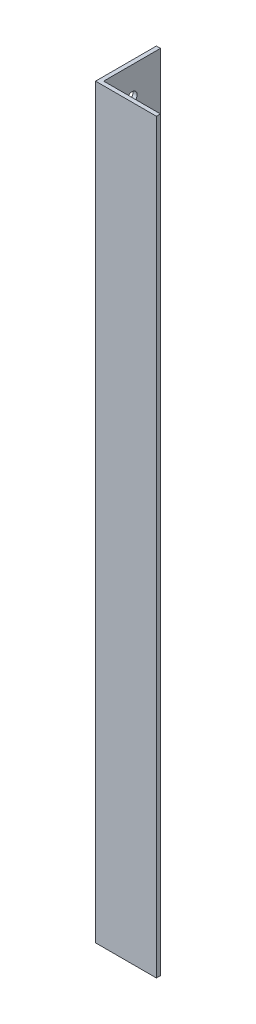
ISO-10303-21;
HEADER;
FILE_DESCRIPTION(('STEP AP214'),'2;1');
FILE_NAME('part.step','',(''),(''),'','','');
FILE_SCHEMA(('AUTOMOTIVE_DESIGN { 1 0 10303 214 1 1 1 1 }'));
ENDSEC;
DATA;
#1=APPLICATION_CONTEXT('core data for automotive mechanical design processes');
#2=APPLICATION_PROTOCOL_DEFINITION('international standard','automotive_design',2000,#1);
#3=PRODUCT_CONTEXT('',#1,'mechanical');
#4=PRODUCT('Part','Part','',(#3));
#5=PRODUCT_RELATED_PRODUCT_CATEGORY('part','',(#4));
#6=PRODUCT_DEFINITION_FORMATION('','',#4);
#7=PRODUCT_DEFINITION_CONTEXT('part definition',#1,'design');
#8=PRODUCT_DEFINITION('design','',#6,#7);
#9=PRODUCT_DEFINITION_SHAPE('','',#8);
#10=(LENGTH_UNIT() NAMED_UNIT(*) SI_UNIT(.MILLI.,.METRE.));
#11=(NAMED_UNIT(*) PLANE_ANGLE_UNIT() SI_UNIT($,.RADIAN.));
#12=(NAMED_UNIT(*) SI_UNIT($,.STERADIAN.) SOLID_ANGLE_UNIT());
#13=UNCERTAINTY_MEASURE_WITH_UNIT(LENGTH_MEASURE(1.E-05),#10,'distance_accuracy_value','');
#14=(GEOMETRIC_REPRESENTATION_CONTEXT(3) GLOBAL_UNCERTAINTY_ASSIGNED_CONTEXT((#13)) GLOBAL_UNIT_ASSIGNED_CONTEXT((#10,
#11,#12)) REPRESENTATION_CONTEXT('',''));
#15=CARTESIAN_POINT('',(0.,0.,0.));
#16=DIRECTION('',(0.,0.,1.));
#17=DIRECTION('',(1.,0.,0.));
#18=AXIS2_PLACEMENT_3D('',#15,#16,#17);
#19=CARTESIAN_POINT('',(0.,184.,0.));
#20=DIRECTION('',(0.,0.,1.));
#21=DIRECTION('',(1.,0.,0.));
#22=AXIS2_PLACEMENT_3D('',#19,#20,#21);
#23=PLANE('',#22);
#24=DIRECTION('',(0.,-1.,0.));
#25=VECTOR('',#24,1.);
#26=CARTESIAN_POINT('',(1.,184.,0.));
#27=LINE('',#26,#25);
#28=CARTESIAN_POINT('',(0.999999999999988,184.,0.));
#29=VERTEX_POINT('',#28);
#30=CARTESIAN_POINT('',(0.999999999999977,0.,0.));
#31=VERTEX_POINT('',#30);
#32=EDGE_CURVE('E50',#29,#31,#27,.T.);
#33=ORIENTED_EDGE('',*,*,#32,.F.);
#34=DIRECTION('',(-1.,0.,0.));
#35=VECTOR('',#34,1.);
#36=CARTESIAN_POINT('',(0.,184.,0.));
#37=LINE('',#36,#35);
#38=CARTESIAN_POINT('',(15.,184.,0.));
#39=VERTEX_POINT('',#38);
#40=EDGE_CURVE('E133',#39,#29,#37,.T.);
#41=ORIENTED_EDGE('',*,*,#40,.F.);
#42=DIRECTION('',(0.,-1.,0.));
#43=VECTOR('',#42,1.);
#44=CARTESIAN_POINT('',(15.,184.,0.));
#45=LINE('',#44,#43);
#46=CARTESIAN_POINT('',(15.,0.,0.));
#47=VERTEX_POINT('',#46);
#48=EDGE_CURVE('E135',#39,#47,#45,.T.);
#49=ORIENTED_EDGE('',*,*,#48,.T.);
#50=DIRECTION('',(-1.,0.,0.));
#51=VECTOR('',#50,1.);
#52=CARTESIAN_POINT('',(0.,0.,0.));
#53=LINE('',#52,#51);
#54=EDGE_CURVE('E103',#47,#31,#53,.T.);
#55=ORIENTED_EDGE('',*,*,#54,.T.);
#56=EDGE_LOOP('',(#33,#41,#49,#55));
#57=FACE_BOUND('',#56,.T.);
#58=ADVANCED_FACE('F34',(#57),#23,.F.);
#59=CARTESIAN_POINT('',(0.,184.,0.));
#60=DIRECTION('',(1.,0.,0.));
#61=DIRECTION('',(0.,0.,-1.));
#62=AXIS2_PLACEMENT_3D('',#59,#60,#61);
#63=PLANE('',#62);
#64=CARTESIAN_POINT('',(0.,92.,-7.00000000000001));
#65=DIRECTION('',(-1.,0.,0.));
#66=DIRECTION('',(0.,0.,1.));
#67=AXIS2_PLACEMENT_3D('',#64,#65,#66);
#68=CIRCLE('',#67,2.);
#69=CARTESIAN_POINT('',(0.,92.,-5.00000000000001));
#70=VERTEX_POINT('',#69);
#71=EDGE_CURVE('E246',#70,#70,#68,.T.);
#72=ORIENTED_EDGE('',*,*,#71,.F.);
#73=EDGE_LOOP('',(#72));
#74=FACE_BOUND('',#73,.T.);
#75=CARTESIAN_POINT('',(0.,7.,-7.));
#76=DIRECTION('',(-1.,0.,0.));
#77=DIRECTION('',(0.,0.,1.));
#78=AXIS2_PLACEMENT_3D('',#75,#76,#77);
#79=CIRCLE('',#78,1.24999999999999);
#80=CARTESIAN_POINT('',(0.,7.,-5.75000000000001));
#81=VERTEX_POINT('',#80);
#82=EDGE_CURVE('E248',#81,#81,#79,.T.);
#83=ORIENTED_EDGE('',*,*,#82,.F.);
#84=EDGE_LOOP('',(#83));
#85=FACE_BOUND('',#84,.T.);
#86=CARTESIAN_POINT('',(0.,177.,-7.));
#87=DIRECTION('',(-1.,0.,0.));
#88=DIRECTION('',(0.,0.,1.));
#89=AXIS2_PLACEMENT_3D('',#86,#87,#88);
#90=CIRCLE('',#89,1.24999999999997);
#91=CARTESIAN_POINT('',(0.,177.,-5.75000000000003));
#92=VERTEX_POINT('',#91);
#93=EDGE_CURVE('E255',#92,#92,#90,.T.);
#94=ORIENTED_EDGE('',*,*,#93,.F.);
#95=EDGE_LOOP('',(#94));
#96=FACE_BOUND('',#95,.T.);
#97=DIRECTION('',(0.,0.,1.));
#98=VECTOR('',#97,1.);
#99=CARTESIAN_POINT('',(0.,0.,0.));
#100=LINE('',#99,#98);
#101=CARTESIAN_POINT('',(0.,0.,-14.));
#102=VERTEX_POINT('',#101);
#103=CARTESIAN_POINT('',(0.,0.,1.));
#104=VERTEX_POINT('',#103);
#105=EDGE_CURVE('E129',#102,#104,#100,.T.);
#106=ORIENTED_EDGE('',*,*,#105,.T.);
#107=DIRECTION('',(0.,-1.,0.));
#108=VECTOR('',#107,1.);
#109=CARTESIAN_POINT('',(0.,184.,1.));
#110=LINE('',#109,#108);
#111=CARTESIAN_POINT('',(0.,184.,1.));
#112=VERTEX_POINT('',#111);
#113=EDGE_CURVE('E11',#112,#104,#110,.T.);
#114=ORIENTED_EDGE('',*,*,#113,.F.);
#115=DIRECTION('',(0.,0.,1.));
#116=VECTOR('',#115,1.);
#117=CARTESIAN_POINT('',(0.,184.,0.));
#118=LINE('',#117,#116);
#119=CARTESIAN_POINT('',(0.,184.,-14.));
#120=VERTEX_POINT('',#119);
#121=EDGE_CURVE('E98',#120,#112,#118,.T.);
#122=ORIENTED_EDGE('',*,*,#121,.F.);
#123=DIRECTION('',(0.,1.,0.));
#124=VECTOR('',#123,1.);
#125=CARTESIAN_POINT('',(0.,184.,-14.));
#126=LINE('',#125,#124);
#127=EDGE_CURVE('E102',#102,#120,#126,.T.);
#128=ORIENTED_EDGE('',*,*,#127,.F.);
#129=EDGE_LOOP('',(#106,#114,#122,#128));
#130=FACE_BOUND('',#129,.T.);
#131=ADVANCED_FACE('F36',(#74,#85,#96,#130),#63,.F.);
#132=CARTESIAN_POINT('',(0.,184.,1.));
#133=DIRECTION('',(0.,0.,-1.));
#134=DIRECTION('',(-1.,0.,0.));
#135=AXIS2_PLACEMENT_3D('',#132,#133,#134);
#136=PLANE('',#135);
#137=DIRECTION('',(1.,0.,0.));
#138=VECTOR('',#137,1.);
#139=CARTESIAN_POINT('',(0.,0.,1.));
#140=LINE('',#139,#138);
#141=CARTESIAN_POINT('',(15.,0.,1.));
#142=VERTEX_POINT('',#141);
#143=EDGE_CURVE('E137',#104,#142,#140,.T.);
#144=ORIENTED_EDGE('',*,*,#143,.T.);
#145=DIRECTION('',(0.,-1.,0.));
#146=VECTOR('',#145,1.);
#147=CARTESIAN_POINT('',(15.,184.,1.));
#148=LINE('',#147,#146);
#149=CARTESIAN_POINT('',(15.,184.,1.));
#150=VERTEX_POINT('',#149);
#151=EDGE_CURVE('E43',#150,#142,#148,.T.);
#152=ORIENTED_EDGE('',*,*,#151,.F.);
#153=DIRECTION('',(1.,0.,0.));
#154=VECTOR('',#153,1.);
#155=CARTESIAN_POINT('',(0.,184.,1.));
#156=LINE('',#155,#154);
#157=EDGE_CURVE('E80',#112,#150,#156,.T.);
#158=ORIENTED_EDGE('',*,*,#157,.F.);
#159=ORIENTED_EDGE('',*,*,#113,.T.);
#160=EDGE_LOOP('',(#144,#152,#158,#159));
#161=FACE_BOUND('',#160,.T.);
#162=ADVANCED_FACE('F167',(#161),#136,.F.);
#163=CARTESIAN_POINT('',(15.,184.,0.));
#164=DIRECTION('',(-1.,0.,0.));
#165=DIRECTION('',(0.,0.,1.));
#166=AXIS2_PLACEMENT_3D('',#163,#164,#165);
#167=PLANE('',#166);
#168=DIRECTION('',(0.,0.,-1.));
#169=VECTOR('',#168,1.);
#170=CARTESIAN_POINT('',(15.,0.,0.));
#171=LINE('',#170,#169);
#172=EDGE_CURVE('E75',#142,#47,#171,.T.);
#173=ORIENTED_EDGE('',*,*,#172,.T.);
#174=ORIENTED_EDGE('',*,*,#48,.F.);
#175=DIRECTION('',(0.,0.,-1.));
#176=VECTOR('',#175,1.);
#177=CARTESIAN_POINT('',(15.,184.,0.));
#178=LINE('',#177,#176);
#179=EDGE_CURVE('E58',#150,#39,#178,.T.);
#180=ORIENTED_EDGE('',*,*,#179,.F.);
#181=ORIENTED_EDGE('',*,*,#151,.T.);
#182=EDGE_LOOP('',(#173,#174,#180,#181));
#183=FACE_BOUND('',#182,.T.);
#184=ADVANCED_FACE('F142',(#183),#167,.F.);
#185=CARTESIAN_POINT('',(0.,184.,0.));
#186=DIRECTION('',(0.,1.,0.));
#187=DIRECTION('',(0.,0.,1.));
#188=AXIS2_PLACEMENT_3D('',#185,#186,#187);
#189=PLANE('',#188);
#190=ORIENTED_EDGE('',*,*,#121,.T.);
#191=ORIENTED_EDGE('',*,*,#157,.T.);
#192=ORIENTED_EDGE('',*,*,#179,.T.);
#193=ORIENTED_EDGE('',*,*,#40,.T.);
#194=DIRECTION('',(0.,0.,1.));
#195=VECTOR('',#194,1.);
#196=CARTESIAN_POINT('',(1.,184.,-14.));
#197=LINE('',#196,#195);
#198=CARTESIAN_POINT('',(1.,184.,-14.));
#199=VERTEX_POINT('',#198);
#200=EDGE_CURVE('E109',#199,#29,#197,.T.);
#201=ORIENTED_EDGE('',*,*,#200,.F.);
#202=DIRECTION('',(1.,0.,0.));
#203=VECTOR('',#202,1.);
#204=CARTESIAN_POINT('',(0.,184.,-14.));
#205=LINE('',#204,#203);
#206=EDGE_CURVE('E106',#120,#199,#205,.T.);
#207=ORIENTED_EDGE('',*,*,#206,.F.);
#208=EDGE_LOOP('',(#190,#191,#192,#193,#201,#207));
#209=FACE_BOUND('',#208,.T.);
#210=ADVANCED_FACE('F107',(#209),#189,.T.);
#211=CARTESIAN_POINT('',(0.,0.,0.));
#212=DIRECTION('',(0.,1.,0.));
#213=DIRECTION('',(0.,0.,1.));
#214=AXIS2_PLACEMENT_3D('',#211,#212,#213);
#215=PLANE('',#214);
#216=ORIENTED_EDGE('',*,*,#105,.F.);
#217=DIRECTION('',(-1.,0.,0.));
#218=VECTOR('',#217,1.);
#219=CARTESIAN_POINT('',(0.,0.,-14.));
#220=LINE('',#219,#218);
#221=CARTESIAN_POINT('',(0.999999999999977,0.,-14.));
#222=VERTEX_POINT('',#221);
#223=EDGE_CURVE('E117',#222,#102,#220,.T.);
#224=ORIENTED_EDGE('',*,*,#223,.F.);
#225=DIRECTION('',(0.,0.,1.));
#226=VECTOR('',#225,1.);
#227=CARTESIAN_POINT('',(0.999999999999977,0.,-14.));
#228=LINE('',#227,#226);
#229=EDGE_CURVE('E125',#222,#31,#228,.T.);
#230=ORIENTED_EDGE('',*,*,#229,.T.);
#231=ORIENTED_EDGE('',*,*,#54,.F.);
#232=ORIENTED_EDGE('',*,*,#172,.F.);
#233=ORIENTED_EDGE('',*,*,#143,.F.);
#234=EDGE_LOOP('',(#216,#224,#230,#231,#232,#233));
#235=FACE_BOUND('',#234,.T.);
#236=ADVANCED_FACE('F145',(#235),#215,.F.);
#237=CARTESIAN_POINT('',(1.,184.,-14.));
#238=DIRECTION('',(-1.,0.,0.));
#239=DIRECTION('',(0.,-1.,0.));
#240=AXIS2_PLACEMENT_3D('',#237,#238,#239);
#241=PLANE('',#240);
#242=CARTESIAN_POINT('',(0.999999999999987,92.,-7.00000000000001));
#243=DIRECTION('',(-1.,0.,0.));
#244=DIRECTION('',(0.,-1.,0.));
#245=AXIS2_PLACEMENT_3D('',#242,#243,#244);
#246=CIRCLE('',#245,2.);
#247=CARTESIAN_POINT('',(0.999999999999987,90.,-7.00000000000001));
#248=VERTEX_POINT('',#247);
#249=EDGE_CURVE('E38',#248,#248,#246,.T.);
#250=ORIENTED_EDGE('',*,*,#249,.T.);
#251=EDGE_LOOP('',(#250));
#252=FACE_BOUND('',#251,.T.);
#253=CARTESIAN_POINT('',(0.999999999999978,7.,-7.));
#254=DIRECTION('',(-1.,0.,0.));
#255=DIRECTION('',(0.,-1.,0.));
#256=AXIS2_PLACEMENT_3D('',#253,#254,#255);
#257=CIRCLE('',#256,1.24999999999999);
#258=CARTESIAN_POINT('',(0.999999999999978,5.75000000000001,-7.));
#259=VERTEX_POINT('',#258);
#260=EDGE_CURVE('E250',#259,#259,#257,.T.);
#261=ORIENTED_EDGE('',*,*,#260,.T.);
#262=EDGE_LOOP('',(#261));
#263=FACE_BOUND('',#262,.T.);
#264=CARTESIAN_POINT('',(0.999999999999999,177.,-7.));
#265=DIRECTION('',(-1.,0.,0.));
#266=DIRECTION('',(0.,-1.,0.));
#267=AXIS2_PLACEMENT_3D('',#264,#265,#266);
#268=CIRCLE('',#267,1.24999999999997);
#269=CARTESIAN_POINT('',(0.999999999999999,175.75,-7.));
#270=VERTEX_POINT('',#269);
#271=EDGE_CURVE('E119',#270,#270,#268,.T.);
#272=ORIENTED_EDGE('',*,*,#271,.T.);
#273=EDGE_LOOP('',(#272));
#274=FACE_BOUND('',#273,.T.);
#275=ORIENTED_EDGE('',*,*,#32,.T.);
#276=ORIENTED_EDGE('',*,*,#229,.F.);
#277=DIRECTION('',(0.,-1.,0.));
#278=VECTOR('',#277,1.);
#279=CARTESIAN_POINT('',(1.,184.,-14.));
#280=LINE('',#279,#278);
#281=EDGE_CURVE('E112',#199,#222,#280,.T.);
#282=ORIENTED_EDGE('',*,*,#281,.F.);
#283=ORIENTED_EDGE('',*,*,#200,.T.);
#284=EDGE_LOOP('',(#275,#276,#282,#283));
#285=FACE_BOUND('',#284,.T.);
#286=ADVANCED_FACE('F148',(#252,#263,#274,#285),#241,.F.);
#287=CARTESIAN_POINT('',(0.,0.,-14.));
#288=DIRECTION('',(0.,0.,1.));
#289=DIRECTION('',(1.,0.,0.));
#290=AXIS2_PLACEMENT_3D('',#287,#288,#289);
#291=PLANE('',#290);
#292=ORIENTED_EDGE('',*,*,#127,.T.);
#293=ORIENTED_EDGE('',*,*,#206,.T.);
#294=ORIENTED_EDGE('',*,*,#281,.T.);
#295=ORIENTED_EDGE('',*,*,#223,.T.);
#296=EDGE_LOOP('',(#292,#293,#294,#295));
#297=FACE_BOUND('',#296,.T.);
#298=ADVANCED_FACE('F115',(#297),#291,.F.);
#299=CARTESIAN_POINT('',(0.,177.,-7.));
#300=DIRECTION('',(-1.,0.,0.));
#301=DIRECTION('',(0.,0.,1.));
#302=AXIS2_PLACEMENT_3D('',#299,#300,#301);
#303=CYLINDRICAL_SURFACE('',#302,1.24999999999997);
#304=ORIENTED_EDGE('',*,*,#93,.T.);
#305=EDGE_LOOP('',(#304));
#306=FACE_BOUND('',#305,.T.);
#307=ORIENTED_EDGE('',*,*,#271,.F.);
#308=EDGE_LOOP('',(#307));
#309=FACE_BOUND('',#308,.T.);
#310=ADVANCED_FACE('F156',(#306,#309),#303,.F.);
#311=CARTESIAN_POINT('',(0.,7.,-7.));
#312=DIRECTION('',(-1.,0.,0.));
#313=DIRECTION('',(0.,0.,1.));
#314=AXIS2_PLACEMENT_3D('',#311,#312,#313);
#315=CYLINDRICAL_SURFACE('',#314,1.24999999999999);
#316=ORIENTED_EDGE('',*,*,#82,.T.);
#317=EDGE_LOOP('',(#316));
#318=FACE_BOUND('',#317,.T.);
#319=ORIENTED_EDGE('',*,*,#260,.F.);
#320=EDGE_LOOP('',(#319));
#321=FACE_BOUND('',#320,.T.);
#322=ADVANCED_FACE('F207',(#318,#321),#315,.F.);
#323=CARTESIAN_POINT('',(92.,92.,-7.00000000000001));
#324=DIRECTION('',(-1.,0.,0.));
#325=DIRECTION('',(0.,0.,1.));
#326=AXIS2_PLACEMENT_3D('',#323,#324,#325);
#327=CYLINDRICAL_SURFACE('',#326,2.);
#328=ORIENTED_EDGE('',*,*,#71,.T.);
#329=EDGE_LOOP('',(#328));
#330=FACE_BOUND('',#329,.T.);
#331=ORIENTED_EDGE('',*,*,#249,.F.);
#332=EDGE_LOOP('',(#331));
#333=FACE_BOUND('',#332,.T.);
#334=ADVANCED_FACE('F217',(#330,#333),#327,.F.);
#335=CLOSED_SHELL('',(#58,#131,#162,#184,#210,#236,#286,#298,#310,#322,#334));
#336=MANIFOLD_SOLID_BREP('B2',#335);
#337=ADVANCED_BREP_SHAPE_REPRESENTATION('',(#18,#336),#14);
#338=SHAPE_DEFINITION_REPRESENTATION(#9,#337);
ENDSEC;
END-ISO-10303-21;
